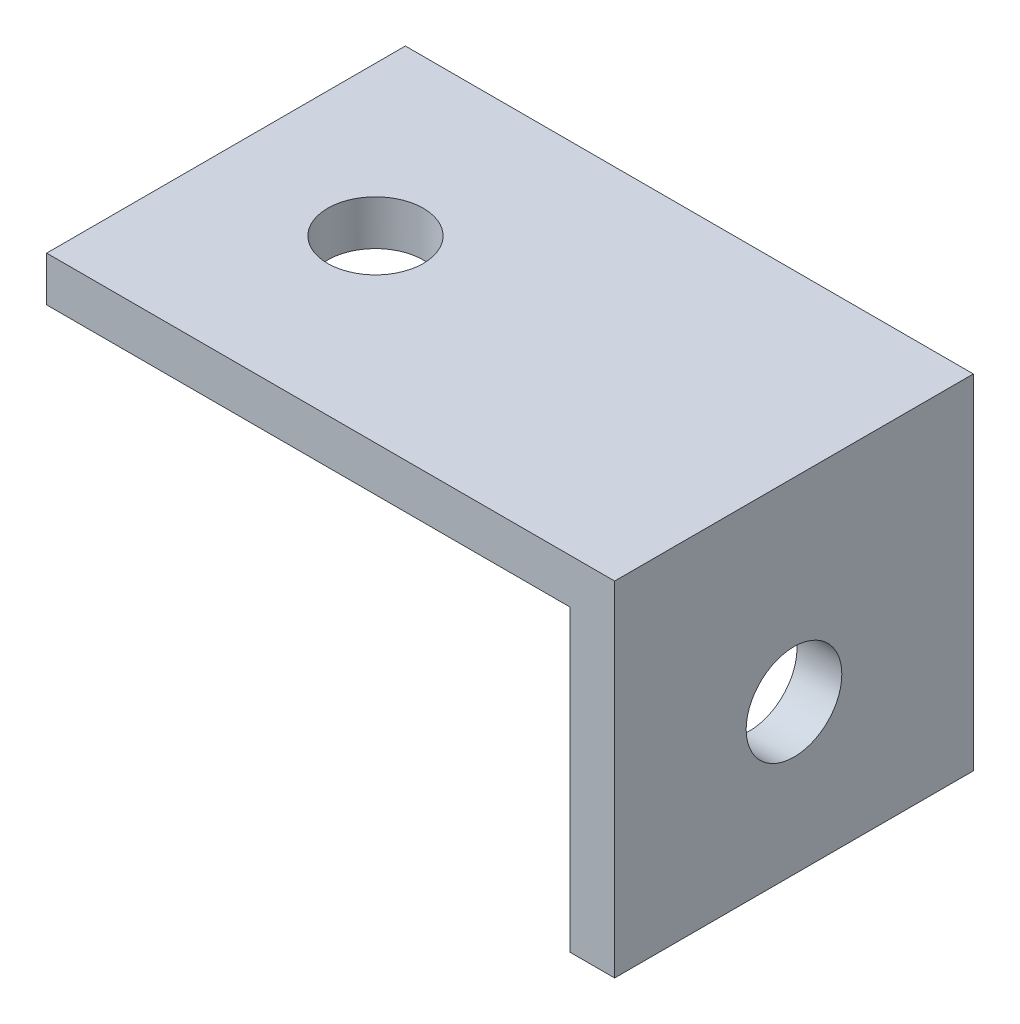
ISO-10303-21;
HEADER;
FILE_DESCRIPTION(('STEP AP214'),'2;1');
FILE_NAME('part.step','',(''),(''),'','','');
FILE_SCHEMA(('AUTOMOTIVE_DESIGN { 1 0 10303 214 1 1 1 1 }'));
ENDSEC;
DATA;
#1=APPLICATION_CONTEXT('core data for automotive mechanical design processes');
#2=APPLICATION_PROTOCOL_DEFINITION('international standard','automotive_design',2000,#1);
#3=PRODUCT_CONTEXT('',#1,'mechanical');
#4=PRODUCT('Part','Part','',(#3));
#5=PRODUCT_RELATED_PRODUCT_CATEGORY('part','',(#4));
#6=PRODUCT_DEFINITION_FORMATION('','',#4);
#7=PRODUCT_DEFINITION_CONTEXT('part definition',#1,'design');
#8=PRODUCT_DEFINITION('design','',#6,#7);
#9=PRODUCT_DEFINITION_SHAPE('','',#8);
#10=(LENGTH_UNIT() NAMED_UNIT(*) SI_UNIT(.MILLI.,.METRE.));
#11=(NAMED_UNIT(*) PLANE_ANGLE_UNIT() SI_UNIT($,.RADIAN.));
#12=(NAMED_UNIT(*) SI_UNIT($,.STERADIAN.) SOLID_ANGLE_UNIT());
#13=UNCERTAINTY_MEASURE_WITH_UNIT(LENGTH_MEASURE(1.E-05),#10,'distance_accuracy_value','');
#14=(GEOMETRIC_REPRESENTATION_CONTEXT(3) GLOBAL_UNCERTAINTY_ASSIGNED_CONTEXT((#13)) GLOBAL_UNIT_ASSIGNED_CONTEXT((#10,
#11,#12)) REPRESENTATION_CONTEXT('',''));
#15=CARTESIAN_POINT('',(0.,0.,0.));
#16=DIRECTION('',(0.,0.,1.));
#17=DIRECTION('',(1.,0.,0.));
#18=AXIS2_PLACEMENT_3D('',#15,#16,#17);
#19=CARTESIAN_POINT('',(-5.,1.5,12.));
#20=DIRECTION('',(1.,0.,0.));
#21=DIRECTION('',(0.,0.,-1.));
#22=AXIS2_PLACEMENT_3D('',#19,#20,#21);
#23=PLANE('',#22);
#24=DIRECTION('',(0.,-1.,0.));
#25=VECTOR('',#24,1.);
#26=CARTESIAN_POINT('',(-5.,1.5,0.));
#27=LINE('',#26,#25);
#28=CARTESIAN_POINT('',(-5.,1.5,0.));
#29=VERTEX_POINT('',#28);
#30=CARTESIAN_POINT('',(-5.,0.,0.));
#31=VERTEX_POINT('',#30);
#32=EDGE_CURVE('E125',#29,#31,#27,.T.);
#33=ORIENTED_EDGE('',*,*,#32,.T.);
#34=DIRECTION('',(0.,0.,-1.));
#35=VECTOR('',#34,1.);
#36=CARTESIAN_POINT('',(-5.,0.,12.));
#37=LINE('',#36,#35);
#38=CARTESIAN_POINT('',(-5.,0.,12.));
#39=VERTEX_POINT('',#38);
#40=EDGE_CURVE('E11',#39,#31,#37,.T.);
#41=ORIENTED_EDGE('',*,*,#40,.F.);
#42=DIRECTION('',(0.,-1.,0.));
#43=VECTOR('',#42,1.);
#44=CARTESIAN_POINT('',(-5.,1.5,12.));
#45=LINE('',#44,#43);
#46=CARTESIAN_POINT('',(-5.,1.5,12.));
#47=VERTEX_POINT('',#46);
#48=EDGE_CURVE('E136',#47,#39,#45,.T.);
#49=ORIENTED_EDGE('',*,*,#48,.F.);
#50=DIRECTION('',(0.,0.,-1.));
#51=VECTOR('',#50,1.);
#52=CARTESIAN_POINT('',(-5.,1.5,12.));
#53=LINE('',#52,#51);
#54=EDGE_CURVE('E121',#47,#29,#53,.T.);
#55=ORIENTED_EDGE('',*,*,#54,.T.);
#56=EDGE_LOOP('',(#33,#41,#49,#55));
#57=FACE_BOUND('',#56,.T.);
#58=ADVANCED_FACE('F39',(#57),#23,.F.);
#59=CARTESIAN_POINT('',(-5.,0.,12.));
#60=DIRECTION('',(0.,1.,0.));
#61=DIRECTION('',(0.,0.,1.));
#62=AXIS2_PLACEMENT_3D('',#59,#60,#61);
#63=PLANE('',#62);
#64=CARTESIAN_POINT('',(0.,0.,6.));
#65=DIRECTION('',(0.,1.,0.));
#66=DIRECTION('',(0.,0.,1.));
#67=AXIS2_PLACEMENT_3D('',#64,#65,#66);
#68=CIRCLE('',#67,1.6);
#69=CARTESIAN_POINT('',(0.,0.,7.6));
#70=VERTEX_POINT('',#69);
#71=EDGE_CURVE('E129',#70,#70,#68,.T.);
#72=ORIENTED_EDGE('',*,*,#71,.T.);
#73=EDGE_LOOP('',(#72));
#74=FACE_BOUND('',#73,.T.);
#75=DIRECTION('',(1.,0.,0.));
#76=VECTOR('',#75,1.);
#77=CARTESIAN_POINT('',(-5.,0.,0.));
#78=LINE('',#77,#76);
#79=CARTESIAN_POINT('',(12.5,0.,0.));
#80=VERTEX_POINT('',#79);
#81=EDGE_CURVE('E128',#31,#80,#78,.T.);
#82=ORIENTED_EDGE('',*,*,#81,.T.);
#83=DIRECTION('',(0.,0.,-1.));
#84=VECTOR('',#83,1.);
#85=CARTESIAN_POINT('',(12.5,0.,12.));
#86=LINE('',#85,#84);
#87=CARTESIAN_POINT('',(12.5,0.,12.));
#88=VERTEX_POINT('',#87);
#89=EDGE_CURVE('E48',#88,#80,#86,.T.);
#90=ORIENTED_EDGE('',*,*,#89,.F.);
#91=DIRECTION('',(1.,0.,0.));
#92=VECTOR('',#91,1.);
#93=CARTESIAN_POINT('',(-5.,0.,12.));
#94=LINE('',#93,#92);
#95=EDGE_CURVE('E94',#39,#88,#94,.T.);
#96=ORIENTED_EDGE('',*,*,#95,.F.);
#97=ORIENTED_EDGE('',*,*,#40,.T.);
#98=EDGE_LOOP('',(#82,#90,#96,#97));
#99=FACE_BOUND('',#98,.T.);
#100=ADVANCED_FACE('F157',(#74,#99),#63,.F.);
#101=CARTESIAN_POINT('',(12.5,0.,12.));
#102=DIRECTION('',(1.,0.,0.));
#103=DIRECTION('',(0.,0.,-1.));
#104=AXIS2_PLACEMENT_3D('',#101,#102,#103);
#105=PLANE('',#104);
#106=CARTESIAN_POINT('',(12.5,-5.,6.));
#107=DIRECTION('',(1.,0.,0.));
#108=DIRECTION('',(0.,0.,-1.));
#109=AXIS2_PLACEMENT_3D('',#106,#107,#108);
#110=CIRCLE('',#109,1.6);
#111=CARTESIAN_POINT('',(12.5,-5.,4.4));
#112=VERTEX_POINT('',#111);
#113=EDGE_CURVE('E143',#112,#112,#110,.T.);
#114=ORIENTED_EDGE('',*,*,#113,.T.);
#115=EDGE_LOOP('',(#114));
#116=FACE_BOUND('',#115,.T.);
#117=DIRECTION('',(0.,-1.,0.));
#118=VECTOR('',#117,1.);
#119=CARTESIAN_POINT('',(12.5,0.,0.));
#120=LINE('',#119,#118);
#121=CARTESIAN_POINT('',(12.5,-10.,0.));
#122=VERTEX_POINT('',#121);
#123=EDGE_CURVE('E131',#80,#122,#120,.T.);
#124=ORIENTED_EDGE('',*,*,#123,.T.);
#125=DIRECTION('',(0.,0.,-1.));
#126=VECTOR('',#125,1.);
#127=CARTESIAN_POINT('',(12.5,-10.,12.));
#128=LINE('',#127,#126);
#129=CARTESIAN_POINT('',(12.5,-10.,12.));
#130=VERTEX_POINT('',#129);
#131=EDGE_CURVE('E116',#130,#122,#128,.T.);
#132=ORIENTED_EDGE('',*,*,#131,.F.);
#133=DIRECTION('',(0.,-1.,0.));
#134=VECTOR('',#133,1.);
#135=CARTESIAN_POINT('',(12.5,0.,12.));
#136=LINE('',#135,#134);
#137=EDGE_CURVE('E107',#88,#130,#136,.T.);
#138=ORIENTED_EDGE('',*,*,#137,.F.);
#139=ORIENTED_EDGE('',*,*,#89,.T.);
#140=EDGE_LOOP('',(#124,#132,#138,#139));
#141=FACE_BOUND('',#140,.T.);
#142=ADVANCED_FACE('F160',(#116,#141),#105,.F.);
#143=CARTESIAN_POINT('',(12.5,-10.,12.));
#144=DIRECTION('',(0.,1.,0.));
#145=DIRECTION('',(0.,0.,1.));
#146=AXIS2_PLACEMENT_3D('',#143,#144,#145);
#147=PLANE('',#146);
#148=DIRECTION('',(1.,0.,0.));
#149=VECTOR('',#148,1.);
#150=CARTESIAN_POINT('',(12.5,-10.,0.));
#151=LINE('',#150,#149);
#152=CARTESIAN_POINT('',(14.,-10.,0.));
#153=VERTEX_POINT('',#152);
#154=EDGE_CURVE('E115',#122,#153,#151,.T.);
#155=ORIENTED_EDGE('',*,*,#154,.T.);
#156=DIRECTION('',(0.,0.,-1.));
#157=VECTOR('',#156,1.);
#158=CARTESIAN_POINT('',(14.,-10.,12.));
#159=LINE('',#158,#157);
#160=CARTESIAN_POINT('',(14.,-10.,12.));
#161=VERTEX_POINT('',#160);
#162=EDGE_CURVE('E112',#161,#153,#159,.T.);
#163=ORIENTED_EDGE('',*,*,#162,.F.);
#164=DIRECTION('',(1.,0.,0.));
#165=VECTOR('',#164,1.);
#166=CARTESIAN_POINT('',(12.5,-10.,12.));
#167=LINE('',#166,#165);
#168=EDGE_CURVE('E101',#130,#161,#167,.T.);
#169=ORIENTED_EDGE('',*,*,#168,.F.);
#170=ORIENTED_EDGE('',*,*,#131,.T.);
#171=EDGE_LOOP('',(#155,#163,#169,#170));
#172=FACE_BOUND('',#171,.T.);
#173=ADVANCED_FACE('F113',(#172),#147,.F.);
#174=CARTESIAN_POINT('',(14.,-10.,12.));
#175=DIRECTION('',(-1.,0.,0.));
#176=DIRECTION('',(0.,0.,1.));
#177=AXIS2_PLACEMENT_3D('',#174,#175,#176);
#178=PLANE('',#177);
#179=CARTESIAN_POINT('',(14.,-5.,6.));
#180=DIRECTION('',(-1.,0.,0.));
#181=DIRECTION('',(0.,0.,1.));
#182=AXIS2_PLACEMENT_3D('',#179,#180,#181);
#183=CIRCLE('',#182,1.6);
#184=CARTESIAN_POINT('',(14.,-5.,7.6));
#185=VERTEX_POINT('',#184);
#186=EDGE_CURVE('E42',#185,#185,#183,.T.);
#187=ORIENTED_EDGE('',*,*,#186,.T.);
#188=EDGE_LOOP('',(#187));
#189=FACE_BOUND('',#188,.T.);
#190=DIRECTION('',(0.,1.,0.));
#191=VECTOR('',#190,1.);
#192=CARTESIAN_POINT('',(14.,-10.,0.));
#193=LINE('',#192,#191);
#194=CARTESIAN_POINT('',(14.,1.5,0.));
#195=VERTEX_POINT('',#194);
#196=EDGE_CURVE('E80',#153,#195,#193,.T.);
#197=ORIENTED_EDGE('',*,*,#196,.T.);
#198=DIRECTION('',(0.,0.,-1.));
#199=VECTOR('',#198,1.);
#200=CARTESIAN_POINT('',(14.,1.5,12.));
#201=LINE('',#200,#199);
#202=CARTESIAN_POINT('',(14.,1.5,12.));
#203=VERTEX_POINT('',#202);
#204=EDGE_CURVE('E117',#203,#195,#201,.T.);
#205=ORIENTED_EDGE('',*,*,#204,.F.);
#206=DIRECTION('',(0.,1.,0.));
#207=VECTOR('',#206,1.);
#208=CARTESIAN_POINT('',(14.,-10.,12.));
#209=LINE('',#208,#207);
#210=EDGE_CURVE('E105',#161,#203,#209,.T.);
#211=ORIENTED_EDGE('',*,*,#210,.F.);
#212=ORIENTED_EDGE('',*,*,#162,.T.);
#213=EDGE_LOOP('',(#197,#205,#211,#212));
#214=FACE_BOUND('',#213,.T.);
#215=ADVANCED_FACE('F119',(#189,#214),#178,.F.);
#216=CARTESIAN_POINT('',(14.,1.5,12.));
#217=DIRECTION('',(0.,-1.,0.));
#218=DIRECTION('',(0.,0.,-1.));
#219=AXIS2_PLACEMENT_3D('',#216,#217,#218);
#220=PLANE('',#219);
#221=CARTESIAN_POINT('',(0.,1.5,6.));
#222=DIRECTION('',(0.,-1.,0.));
#223=DIRECTION('',(0.,0.,-1.));
#224=AXIS2_PLACEMENT_3D('',#221,#222,#223);
#225=CIRCLE('',#224,1.6);
#226=CARTESIAN_POINT('',(0.,1.5,4.4));
#227=VERTEX_POINT('',#226);
#228=EDGE_CURVE('E141',#227,#227,#225,.T.);
#229=ORIENTED_EDGE('',*,*,#228,.T.);
#230=EDGE_LOOP('',(#229));
#231=FACE_BOUND('',#230,.T.);
#232=DIRECTION('',(-1.,0.,0.));
#233=VECTOR('',#232,1.);
#234=CARTESIAN_POINT('',(14.,1.5,0.));
#235=LINE('',#234,#233);
#236=EDGE_CURVE('E86',#195,#29,#235,.T.);
#237=ORIENTED_EDGE('',*,*,#236,.T.);
#238=ORIENTED_EDGE('',*,*,#54,.F.);
#239=DIRECTION('',(-1.,0.,0.));
#240=VECTOR('',#239,1.);
#241=CARTESIAN_POINT('',(14.,1.5,12.));
#242=LINE('',#241,#240);
#243=EDGE_CURVE('E57',#203,#47,#242,.T.);
#244=ORIENTED_EDGE('',*,*,#243,.F.);
#245=ORIENTED_EDGE('',*,*,#204,.T.);
#246=EDGE_LOOP('',(#237,#238,#244,#245));
#247=FACE_BOUND('',#246,.T.);
#248=ADVANCED_FACE('F165',(#231,#247),#220,.F.);
#249=CARTESIAN_POINT('',(0.,0.,12.));
#250=DIRECTION('',(0.,0.,1.));
#251=DIRECTION('',(1.,0.,0.));
#252=AXIS2_PLACEMENT_3D('',#249,#250,#251);
#253=PLANE('',#252);
#254=ORIENTED_EDGE('',*,*,#48,.T.);
#255=ORIENTED_EDGE('',*,*,#95,.T.);
#256=ORIENTED_EDGE('',*,*,#137,.T.);
#257=ORIENTED_EDGE('',*,*,#168,.T.);
#258=ORIENTED_EDGE('',*,*,#210,.T.);
#259=ORIENTED_EDGE('',*,*,#243,.T.);
#260=EDGE_LOOP('',(#254,#255,#256,#257,#258,#259));
#261=FACE_BOUND('',#260,.T.);
#262=ADVANCED_FACE('F103',(#261),#253,.T.);
#263=CARTESIAN_POINT('',(0.,0.,0.));
#264=DIRECTION('',(0.,0.,1.));
#265=DIRECTION('',(1.,0.,0.));
#266=AXIS2_PLACEMENT_3D('',#263,#264,#265);
#267=PLANE('',#266);
#268=ORIENTED_EDGE('',*,*,#32,.F.);
#269=ORIENTED_EDGE('',*,*,#236,.F.);
#270=ORIENTED_EDGE('',*,*,#196,.F.);
#271=ORIENTED_EDGE('',*,*,#154,.F.);
#272=ORIENTED_EDGE('',*,*,#123,.F.);
#273=ORIENTED_EDGE('',*,*,#81,.F.);
#274=EDGE_LOOP('',(#268,#269,#270,#271,#272,#273));
#275=FACE_BOUND('',#274,.T.);
#276=ADVANCED_FACE('F163',(#275),#267,.F.);
#277=CARTESIAN_POINT('',(0.,-100.,6.));
#278=DIRECTION('',(0.,1.,0.));
#279=DIRECTION('',(0.,0.,1.));
#280=AXIS2_PLACEMENT_3D('',#277,#278,#279);
#281=CYLINDRICAL_SURFACE('',#280,1.6);
#282=ORIENTED_EDGE('',*,*,#228,.F.);
#283=EDGE_LOOP('',(#282));
#284=FACE_BOUND('',#283,.T.);
#285=ORIENTED_EDGE('',*,*,#71,.F.);
#286=EDGE_LOOP('',(#285));
#287=FACE_BOUND('',#286,.T.);
#288=ADVANCED_FACE('F210',(#284,#287),#281,.F.);
#289=CARTESIAN_POINT('',(-100.,-5.,6.));
#290=DIRECTION('',(1.,0.,0.));
#291=DIRECTION('',(0.,0.,-1.));
#292=AXIS2_PLACEMENT_3D('',#289,#290,#291);
#293=CYLINDRICAL_SURFACE('',#292,1.6);
#294=ORIENTED_EDGE('',*,*,#186,.F.);
#295=EDGE_LOOP('',(#294));
#296=FACE_BOUND('',#295,.T.);
#297=ORIENTED_EDGE('',*,*,#113,.F.);
#298=EDGE_LOOP('',(#297));
#299=FACE_BOUND('',#298,.T.);
#300=ADVANCED_FACE('F206',(#296,#299),#293,.F.);
#301=CLOSED_SHELL('',(#58,#100,#142,#173,#215,#248,#262,#276,#288,#300));
#302=MANIFOLD_SOLID_BREP('B2',#301);
#303=ADVANCED_BREP_SHAPE_REPRESENTATION('',(#18,#302),#14);
#304=SHAPE_DEFINITION_REPRESENTATION(#9,#303);
ENDSEC;
END-ISO-10303-21;
